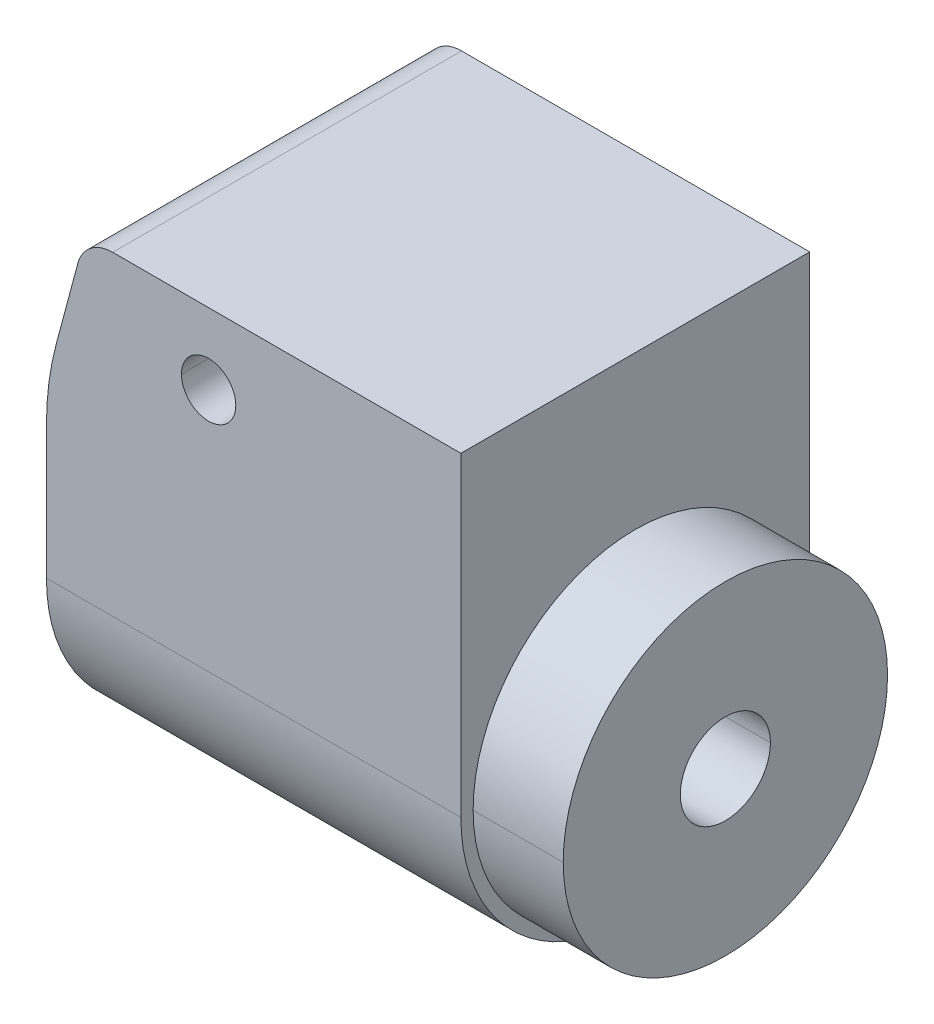
ISO-10303-21;
HEADER;
FILE_DESCRIPTION(('STEP AP214'),'2;1');
FILE_NAME('part.step','',(''),(''),'','','');
FILE_SCHEMA(('AUTOMOTIVE_DESIGN { 1 0 10303 214 1 1 1 1 }'));
ENDSEC;
DATA;
#1=APPLICATION_CONTEXT('core data for automotive mechanical design processes');
#2=APPLICATION_PROTOCOL_DEFINITION('international standard','automotive_design',2000,#1);
#3=PRODUCT_CONTEXT('',#1,'mechanical');
#4=PRODUCT('Part','Part','',(#3));
#5=PRODUCT_RELATED_PRODUCT_CATEGORY('part','',(#4));
#6=PRODUCT_DEFINITION_FORMATION('','',#4);
#7=PRODUCT_DEFINITION_CONTEXT('part definition',#1,'design');
#8=PRODUCT_DEFINITION('design','',#6,#7);
#9=PRODUCT_DEFINITION_SHAPE('','',#8);
#10=(LENGTH_UNIT() NAMED_UNIT(*) SI_UNIT(.MILLI.,.METRE.));
#11=(NAMED_UNIT(*) PLANE_ANGLE_UNIT() SI_UNIT($,.RADIAN.));
#12=(NAMED_UNIT(*) SI_UNIT($,.STERADIAN.) SOLID_ANGLE_UNIT());
#13=UNCERTAINTY_MEASURE_WITH_UNIT(LENGTH_MEASURE(1.E-05),#10,'distance_accuracy_value','');
#14=(GEOMETRIC_REPRESENTATION_CONTEXT(3) GLOBAL_UNCERTAINTY_ASSIGNED_CONTEXT((#13)) GLOBAL_UNIT_ASSIGNED_CONTEXT((#10,
#11,#12)) REPRESENTATION_CONTEXT('',''));
#15=CARTESIAN_POINT('',(0.,0.,0.));
#16=DIRECTION('',(0.,0.,1.));
#17=DIRECTION('',(1.,0.,0.));
#18=AXIS2_PLACEMENT_3D('',#15,#16,#17);
#19=CARTESIAN_POINT('',(-33.4137,72.85602656128,36.5125));
#20=DIRECTION('',(0.,0.,-1.));
#21=DIRECTION('',(-1.,0.,0.));
#22=AXIS2_PLACEMENT_3D('',#19,#20,#21);
#23=CYLINDRICAL_SURFACE('',#22,25.4);
#24=CARTESIAN_POINT('',(-33.4137,72.85602656128,51.8795));
#25=DIRECTION('',(0.,0.,1.));
#26=DIRECTION('',(0.,1.,0.));
#27=AXIS2_PLACEMENT_3D('',#24,#25,#26);
#28=CIRCLE('',#27,25.4);
#29=CARTESIAN_POINT('',(-57.9482159877424,79.430030306884,51.8795));
#30=VERTEX_POINT('',#29);
#31=CARTESIAN_POINT('',(-58.8137,72.85602656128,51.8795));
#32=VERTEX_POINT('',#31);
#33=EDGE_CURVE('E109',#30,#32,#28,.T.);
#34=ORIENTED_EDGE('',*,*,#33,.F.);
#35=DIRECTION('',(0.,0.,1.));
#36=VECTOR('',#35,1.);
#37=CARTESIAN_POINT('',(-57.9482159877424,79.430030306884,51.8795));
#38=LINE('',#37,#36);
#39=CARTESIAN_POINT('',(-57.9482159877424,79.430030306884,21.1455));
#40=VERTEX_POINT('',#39);
#41=EDGE_CURVE('E27',#40,#30,#38,.T.);
#42=ORIENTED_EDGE('',*,*,#41,.F.);
#43=CARTESIAN_POINT('',(-33.4137,72.85602656128,21.1455));
#44=DIRECTION('',(0.,0.,-1.));
#45=DIRECTION('',(0.,-1.,0.));
#46=AXIS2_PLACEMENT_3D('',#43,#44,#45);
#47=CIRCLE('',#46,25.4);
#48=CARTESIAN_POINT('',(-58.8137,72.85602656128,21.1455));
#49=VERTEX_POINT('',#48);
#50=EDGE_CURVE('E174',#49,#40,#47,.T.);
#51=ORIENTED_EDGE('',*,*,#50,.F.);
#52=DIRECTION('',(0.,0.,-1.));
#53=VECTOR('',#52,1.);
#54=CARTESIAN_POINT('',(-58.8137,72.85602656128,21.1455));
#55=LINE('',#54,#53);
#56=EDGE_CURVE('E42',#32,#49,#55,.T.);
#57=ORIENTED_EDGE('',*,*,#56,.F.);
#58=EDGE_LOOP('',(#34,#42,#51,#57));
#59=FACE_BOUND('',#58,.T.);
#60=ADVANCED_FACE('F16',(#59),#23,.T.);
#61=CARTESIAN_POINT('',(-52.9744820692915,85.725,51.8795));
#62=DIRECTION('',(0.,0.,1.));
#63=DIRECTION('',(1.,0.,0.));
#64=AXIS2_PLACEMENT_3D('',#61,#62,#63);
#65=CYLINDRICAL_SURFACE('',#64,3.175);
#66=CARTESIAN_POINT('',(-52.9744820692915,85.725,21.1455));
#67=DIRECTION('',(0.,0.,-1.));
#68=DIRECTION('',(0.,-1.,0.));
#69=AXIS2_PLACEMENT_3D('',#66,#67,#68);
#70=CIRCLE('',#69,3.175);
#71=CARTESIAN_POINT('',(-56.0412965677594,86.5467504682005,21.1455));
#72=VERTEX_POINT('',#71);
#73=CARTESIAN_POINT('',(-52.9744820692915,88.9,21.1455));
#74=VERTEX_POINT('',#73);
#75=EDGE_CURVE('E89',#72,#74,#70,.T.);
#76=ORIENTED_EDGE('',*,*,#75,.F.);
#77=DIRECTION('',(0.,0.,-1.));
#78=VECTOR('',#77,1.);
#79=CARTESIAN_POINT('',(-56.0412965677594,86.5467504682005,21.1455));
#80=LINE('',#79,#78);
#81=CARTESIAN_POINT('',(-56.0412965677594,86.5467504682005,51.8795));
#82=VERTEX_POINT('',#81);
#83=EDGE_CURVE('E10',#82,#72,#80,.T.);
#84=ORIENTED_EDGE('',*,*,#83,.F.);
#85=CARTESIAN_POINT('',(-52.9744820692915,85.725,51.8795));
#86=DIRECTION('',(0.,0.,1.));
#87=DIRECTION('',(0.,1.,0.));
#88=AXIS2_PLACEMENT_3D('',#85,#86,#87);
#89=CIRCLE('',#88,3.175);
#90=CARTESIAN_POINT('',(-52.9744820692915,88.9,51.8795));
#91=VERTEX_POINT('',#90);
#92=EDGE_CURVE('E85',#91,#82,#89,.T.);
#93=ORIENTED_EDGE('',*,*,#92,.F.);
#94=DIRECTION('',(0.,0.,1.));
#95=VECTOR('',#94,1.);
#96=CARTESIAN_POINT('',(-52.9744820692915,88.9,51.8795));
#97=LINE('',#96,#95);
#98=EDGE_CURVE('E118',#74,#91,#97,.T.);
#99=ORIENTED_EDGE('',*,*,#98,.F.);
#100=EDGE_LOOP('',(#76,#84,#93,#99));
#101=FACE_BOUND('',#100,.T.);
#102=ADVANCED_FACE('F83',(#101),#65,.T.);
#103=CARTESIAN_POINT('',(-55.4107452561247,88.9,51.8795));
#104=DIRECTION('',(0.965925826289069,-0.258819045102518,0.));
#105=DIRECTION('',(0.,0.,-1.));
#106=AXIS2_PLACEMENT_3D('',#103,#104,#105);
#107=PLANE('',#106);
#108=DIRECTION('',(0.258819045102518,0.965925826289069,0.));
#109=VECTOR('',#108,1.);
#110=CARTESIAN_POINT('',(-55.4107452561247,88.9,21.1455));
#111=LINE('',#110,#109);
#112=EDGE_CURVE('E184',#40,#72,#111,.T.);
#113=ORIENTED_EDGE('',*,*,#112,.F.);
#114=ORIENTED_EDGE('',*,*,#41,.T.);
#115=DIRECTION('',(-0.258819045102518,-0.965925826289069,0.));
#116=VECTOR('',#115,1.);
#117=CARTESIAN_POINT('',(-55.4107452561247,88.9,51.8795));
#118=LINE('',#117,#116);
#119=EDGE_CURVE('E98',#82,#30,#118,.T.);
#120=ORIENTED_EDGE('',*,*,#119,.F.);
#121=ORIENTED_EDGE('',*,*,#83,.T.);
#122=EDGE_LOOP('',(#113,#114,#120,#121));
#123=FACE_BOUND('',#122,.T.);
#124=ADVANCED_FACE('F18',(#123),#107,.F.);
#125=CARTESIAN_POINT('',(-44.5262,82.63255,21.1455));
#126=DIRECTION('',(0.,0.,1.));
#127=DIRECTION('',(1.,0.,0.));
#128=AXIS2_PLACEMENT_3D('',#125,#126,#127);
#129=CYLINDRICAL_SURFACE('',#128,2.39395);
#130=DIRECTION('',(0.,0.,1.));
#131=VECTOR('',#130,1.);
#132=CARTESIAN_POINT('',(-46.92015,82.63255,21.1455));
#133=LINE('',#132,#131);
#134=CARTESIAN_POINT('',(-46.92015,82.63255,21.1455));
#135=VERTEX_POINT('',#134);
#136=CARTESIAN_POINT('',(-46.92015,82.63255,51.8795));
#137=VERTEX_POINT('',#136);
#138=EDGE_CURVE('E169',#135,#137,#133,.T.);
#139=ORIENTED_EDGE('',*,*,#138,.F.);
#140=CARTESIAN_POINT('',(-44.5262,82.63255,21.1455));
#141=DIRECTION('',(0.,0.,1.));
#142=DIRECTION('',(1.,0.,0.));
#143=AXIS2_PLACEMENT_3D('',#140,#141,#142);
#144=CIRCLE('',#143,2.39395);
#145=CARTESIAN_POINT('',(-42.13225,82.63255,21.1455));
#146=VERTEX_POINT('',#145);
#147=EDGE_CURVE('E180',#146,#135,#144,.T.);
#148=ORIENTED_EDGE('',*,*,#147,.F.);
#149=DIRECTION('',(0.,0.,1.));
#150=VECTOR('',#149,1.);
#151=CARTESIAN_POINT('',(-42.13225,82.63255,21.1455));
#152=LINE('',#151,#150);
#153=CARTESIAN_POINT('',(-42.13225,82.63255,51.8795));
#154=VERTEX_POINT('',#153);
#155=EDGE_CURVE('E131',#146,#154,#152,.T.);
#156=ORIENTED_EDGE('',*,*,#155,.T.);
#157=CARTESIAN_POINT('',(-44.5262,82.63255,51.8795));
#158=DIRECTION('',(0.,0.,1.));
#159=DIRECTION('',(1.,0.,0.));
#160=AXIS2_PLACEMENT_3D('',#157,#158,#159);
#161=CIRCLE('',#160,2.39395);
#162=EDGE_CURVE('E104',#154,#137,#161,.T.);
#163=ORIENTED_EDGE('',*,*,#162,.T.);
#164=EDGE_LOOP('',(#139,#148,#156,#163));
#165=FACE_BOUND('',#164,.T.);
#166=ADVANCED_FACE('F417',(#165),#129,.F.);
#167=CARTESIAN_POINT('',(-58.8137,61.11875,36.5125));
#168=DIRECTION('',(1.,0.,0.));
#169=DIRECTION('',(0.,0.,-1.));
#170=AXIS2_PLACEMENT_3D('',#167,#168,#169);
#171=CYLINDRICAL_SURFACE('',#170,3.96875);
#172=DIRECTION('',(1.,0.,0.));
#173=VECTOR('',#172,1.);
#174=CARTESIAN_POINT('',(-58.8137,61.11875,40.48125));
#175=LINE('',#174,#173);
#176=CARTESIAN_POINT('',(-58.8137,61.11875,40.48125));
#177=VERTEX_POINT('',#176);
#178=CARTESIAN_POINT('',(-14.3637,61.11875,40.48125));
#179=VERTEX_POINT('',#178);
#180=EDGE_CURVE('E151',#177,#179,#175,.T.);
#181=ORIENTED_EDGE('',*,*,#180,.F.);
#182=CARTESIAN_POINT('',(-58.8137,61.11875,36.5125));
#183=DIRECTION('',(1.,0.,0.));
#184=DIRECTION('',(0.,0.,-1.));
#185=AXIS2_PLACEMENT_3D('',#182,#183,#184);
#186=CIRCLE('',#185,3.96875);
#187=CARTESIAN_POINT('',(-58.8137,61.11875,32.54375));
#188=VERTEX_POINT('',#187);
#189=EDGE_CURVE('E179',#188,#177,#186,.T.);
#190=ORIENTED_EDGE('',*,*,#189,.F.);
#191=DIRECTION('',(1.,0.,0.));
#192=VECTOR('',#191,1.);
#193=CARTESIAN_POINT('',(-58.8137,61.11875,32.54375));
#194=LINE('',#193,#192);
#195=CARTESIAN_POINT('',(-14.3637,61.11875,32.54375));
#196=VERTEX_POINT('',#195);
#197=EDGE_CURVE('E144',#188,#196,#194,.T.);
#198=ORIENTED_EDGE('',*,*,#197,.T.);
#199=CARTESIAN_POINT('',(-14.3637,61.11875,36.5125));
#200=DIRECTION('',(1.,0.,0.));
#201=DIRECTION('',(0.,0.,-1.));
#202=AXIS2_PLACEMENT_3D('',#199,#200,#201);
#203=CIRCLE('',#202,3.96875);
#204=EDGE_CURVE('E136',#196,#179,#203,.T.);
#205=ORIENTED_EDGE('',*,*,#204,.T.);
#206=EDGE_LOOP('',(#181,#190,#198,#205));
#207=FACE_BOUND('',#206,.T.);
#208=ADVANCED_FACE('F421',(#207),#171,.F.);
#209=CARTESIAN_POINT('',(-14.3637,61.11875,36.5125));
#210=DIRECTION('',(1.,0.,0.));
#211=DIRECTION('',(0.,1.,0.));
#212=AXIS2_PLACEMENT_3D('',#209,#210,#211);
#213=PLANE('',#212);
#214=ORIENTED_EDGE('',*,*,#204,.F.);
#215=CARTESIAN_POINT('',(-14.3637,61.11875,36.5125));
#216=DIRECTION('',(1.,0.,0.));
#217=DIRECTION('',(0.,0.,-1.));
#218=AXIS2_PLACEMENT_3D('',#215,#216,#217);
#219=CIRCLE('',#218,3.96875);
#220=EDGE_CURVE('E155',#179,#196,#219,.T.);
#221=ORIENTED_EDGE('',*,*,#220,.F.);
#222=EDGE_LOOP('',(#214,#221));
#223=FACE_BOUND('',#222,.T.);
#224=CARTESIAN_POINT('',(-14.3637,61.11875,36.5125));
#225=DIRECTION('',(1.,0.,0.));
#226=DIRECTION('',(0.,0.,-1.));
#227=AXIS2_PLACEMENT_3D('',#224,#225,#226);
#228=CIRCLE('',#227,14.2875);
#229=CARTESIAN_POINT('',(-14.3637,61.11875,50.8));
#230=VERTEX_POINT('',#229);
#231=CARTESIAN_POINT('',(-14.3637,61.11875,22.225));
#232=VERTEX_POINT('',#231);
#233=EDGE_CURVE('E139',#230,#232,#228,.T.);
#234=ORIENTED_EDGE('',*,*,#233,.T.);
#235=CARTESIAN_POINT('',(-14.3637,61.11875,36.5125));
#236=DIRECTION('',(1.,0.,0.));
#237=DIRECTION('',(0.,0.,-1.));
#238=AXIS2_PLACEMENT_3D('',#235,#236,#237);
#239=CIRCLE('',#238,14.2875);
#240=EDGE_CURVE('E140',#232,#230,#239,.T.);
#241=ORIENTED_EDGE('',*,*,#240,.T.);
#242=EDGE_LOOP('',(#234,#241));
#243=FACE_BOUND('',#242,.T.);
#244=ADVANCED_FACE('F388',(#223,#243),#213,.T.);
#245=CARTESIAN_POINT('',(-14.3637,61.11875,36.5125));
#246=DIRECTION('',(-1.,0.,0.));
#247=DIRECTION('',(0.,0.,1.));
#248=AXIS2_PLACEMENT_3D('',#245,#246,#247);
#249=CYLINDRICAL_SURFACE('',#248,14.2875);
#250=DIRECTION('',(-1.,0.,0.));
#251=VECTOR('',#250,1.);
#252=CARTESIAN_POINT('',(-14.3637,61.11875,22.225));
#253=LINE('',#252,#251);
#254=CARTESIAN_POINT('',(-22.3012,61.11875,22.225));
#255=VERTEX_POINT('',#254);
#256=EDGE_CURVE('E143',#232,#255,#253,.T.);
#257=ORIENTED_EDGE('',*,*,#256,.F.);
#258=ORIENTED_EDGE('',*,*,#233,.F.);
#259=DIRECTION('',(-1.,0.,0.));
#260=VECTOR('',#259,1.);
#261=CARTESIAN_POINT('',(-14.3637,61.11875,50.8));
#262=LINE('',#261,#260);
#263=CARTESIAN_POINT('',(-22.3012,61.11875,50.8));
#264=VERTEX_POINT('',#263);
#265=EDGE_CURVE('E149',#230,#264,#262,.T.);
#266=ORIENTED_EDGE('',*,*,#265,.T.);
#267=CARTESIAN_POINT('',(-22.3012,61.11875,36.5125));
#268=DIRECTION('',(1.,0.,0.));
#269=DIRECTION('',(0.,0.,-1.));
#270=AXIS2_PLACEMENT_3D('',#267,#268,#269);
#271=CIRCLE('',#270,14.2875);
#272=EDGE_CURVE('E124',#264,#255,#271,.T.);
#273=ORIENTED_EDGE('',*,*,#272,.T.);
#274=EDGE_LOOP('',(#257,#258,#266,#273));
#275=FACE_BOUND('',#274,.T.);
#276=ADVANCED_FACE('F384',(#275),#249,.T.);
#277=CARTESIAN_POINT('',(-58.8137,61.11875,36.5125));
#278=DIRECTION('',(1.,0.,0.));
#279=DIRECTION('',(0.,1.,0.));
#280=AXIS2_PLACEMENT_3D('',#277,#278,#279);
#281=PLANE('',#280);
#282=ORIENTED_EDGE('',*,*,#189,.T.);
#283=CARTESIAN_POINT('',(-58.8137,61.11875,36.5125));
#284=DIRECTION('',(1.,0.,0.));
#285=DIRECTION('',(0.,0.,-1.));
#286=AXIS2_PLACEMENT_3D('',#283,#284,#285);
#287=CIRCLE('',#286,3.96875);
#288=EDGE_CURVE('E122',#177,#188,#287,.T.);
#289=ORIENTED_EDGE('',*,*,#288,.T.);
#290=EDGE_LOOP('',(#282,#289));
#291=FACE_BOUND('',#290,.T.);
#292=DIRECTION('',(0.,-1.,0.));
#293=VECTOR('',#292,1.);
#294=CARTESIAN_POINT('',(-58.8137,61.11875,51.8795));
#295=LINE('',#294,#293);
#296=CARTESIAN_POINT('',(-58.8137,61.11875,51.8795));
#297=VERTEX_POINT('',#296);
#298=EDGE_CURVE('E105',#32,#297,#295,.T.);
#299=ORIENTED_EDGE('',*,*,#298,.F.);
#300=ORIENTED_EDGE('',*,*,#56,.T.);
#301=DIRECTION('',(0.,1.,0.));
#302=VECTOR('',#301,1.);
#303=CARTESIAN_POINT('',(-58.8137,88.9,21.1455));
#304=LINE('',#303,#302);
#305=CARTESIAN_POINT('',(-58.8137,61.11875,21.1455));
#306=VERTEX_POINT('',#305);
#307=EDGE_CURVE('E170',#306,#49,#304,.T.);
#308=ORIENTED_EDGE('',*,*,#307,.F.);
#309=CARTESIAN_POINT('',(-58.8137,61.11875,36.5125));
#310=DIRECTION('',(1.,0.,0.));
#311=DIRECTION('',(0.,0.,-1.));
#312=AXIS2_PLACEMENT_3D('',#309,#310,#311);
#313=CIRCLE('',#312,15.367);
#314=EDGE_CURVE('E126',#297,#306,#313,.T.);
#315=ORIENTED_EDGE('',*,*,#314,.F.);
#316=EDGE_LOOP('',(#299,#300,#308,#315));
#317=FACE_BOUND('',#316,.T.);
#318=ADVANCED_FACE('F351',(#291,#317),#281,.F.);
#319=CARTESIAN_POINT('',(-22.3012,61.11875,51.8795));
#320=DIRECTION('',(0.,0.,-1.));
#321=DIRECTION('',(0.,-1.,0.));
#322=AXIS2_PLACEMENT_3D('',#319,#320,#321);
#323=PLANE('',#322);
#324=ORIENTED_EDGE('',*,*,#162,.F.);
#325=CARTESIAN_POINT('',(-44.5262,82.63255,51.8795));
#326=DIRECTION('',(0.,0.,1.));
#327=DIRECTION('',(1.,0.,0.));
#328=AXIS2_PLACEMENT_3D('',#325,#326,#327);
#329=CIRCLE('',#328,2.39395);
#330=EDGE_CURVE('E135',#137,#154,#329,.T.);
#331=ORIENTED_EDGE('',*,*,#330,.F.);
#332=EDGE_LOOP('',(#324,#331));
#333=FACE_BOUND('',#332,.T.);
#334=ORIENTED_EDGE('',*,*,#119,.T.);
#335=ORIENTED_EDGE('',*,*,#33,.T.);
#336=ORIENTED_EDGE('',*,*,#298,.T.);
#337=DIRECTION('',(-1.,0.,0.));
#338=VECTOR('',#337,1.);
#339=CARTESIAN_POINT('',(-22.3012,61.11875,51.8795));
#340=LINE('',#339,#338);
#341=CARTESIAN_POINT('',(-22.3012,61.11875,51.8795));
#342=VERTEX_POINT('',#341);
#343=EDGE_CURVE('E175',#342,#297,#340,.T.);
#344=ORIENTED_EDGE('',*,*,#343,.F.);
#345=DIRECTION('',(0.,-1.,0.));
#346=VECTOR('',#345,1.);
#347=CARTESIAN_POINT('',(-22.3012,61.11875,51.8795));
#348=LINE('',#347,#346);
#349=CARTESIAN_POINT('',(-22.3012,88.9,51.8795));
#350=VERTEX_POINT('',#349);
#351=EDGE_CURVE('E127',#350,#342,#348,.T.);
#352=ORIENTED_EDGE('',*,*,#351,.F.);
#353=DIRECTION('',(-1.,0.,0.));
#354=VECTOR('',#353,1.);
#355=CARTESIAN_POINT('',(-22.3012,88.9,51.8795));
#356=LINE('',#355,#354);
#357=EDGE_CURVE('E101',#350,#91,#356,.T.);
#358=ORIENTED_EDGE('',*,*,#357,.T.);
#359=ORIENTED_EDGE('',*,*,#92,.T.);
#360=EDGE_LOOP('',(#334,#335,#336,#344,#352,#358,#359));
#361=FACE_BOUND('',#360,.T.);
#362=ADVANCED_FACE('F96',(#333,#361),#323,.F.);
#363=CARTESIAN_POINT('',(-22.3012,88.9,51.8795));
#364=DIRECTION('',(0.,-1.,0.));
#365=DIRECTION('',(0.,0.,-1.));
#366=AXIS2_PLACEMENT_3D('',#363,#364,#365);
#367=PLANE('',#366);
#368=DIRECTION('',(-1.,0.,0.));
#369=VECTOR('',#368,1.);
#370=CARTESIAN_POINT('',(-22.3012,88.9,21.1455));
#371=LINE('',#370,#369);
#372=CARTESIAN_POINT('',(-22.3012,88.9,21.1455));
#373=VERTEX_POINT('',#372);
#374=EDGE_CURVE('E20',#373,#74,#371,.T.);
#375=ORIENTED_EDGE('',*,*,#374,.T.);
#376=ORIENTED_EDGE('',*,*,#98,.T.);
#377=ORIENTED_EDGE('',*,*,#357,.F.);
#378=DIRECTION('',(0.,0.,1.));
#379=VECTOR('',#378,1.);
#380=CARTESIAN_POINT('',(-22.3012,88.9,51.8795));
#381=LINE('',#380,#379);
#382=EDGE_CURVE('E163',#373,#350,#381,.T.);
#383=ORIENTED_EDGE('',*,*,#382,.F.);
#384=EDGE_LOOP('',(#375,#376,#377,#383));
#385=FACE_BOUND('',#384,.T.);
#386=ADVANCED_FACE('F350',(#385),#367,.F.);
#387=CARTESIAN_POINT('',(-22.3012,88.9,21.1455));
#388=DIRECTION('',(0.,0.,1.));
#389=DIRECTION('',(0.,-1.,0.));
#390=AXIS2_PLACEMENT_3D('',#387,#388,#389);
#391=PLANE('',#390);
#392=ORIENTED_EDGE('',*,*,#147,.T.);
#393=CARTESIAN_POINT('',(-44.5262,82.63255,21.1455));
#394=DIRECTION('',(0.,0.,1.));
#395=DIRECTION('',(1.,0.,0.));
#396=AXIS2_PLACEMENT_3D('',#393,#394,#395);
#397=CIRCLE('',#396,2.39395);
#398=EDGE_CURVE('E165',#135,#146,#397,.T.);
#399=ORIENTED_EDGE('',*,*,#398,.T.);
#400=EDGE_LOOP('',(#392,#399));
#401=FACE_BOUND('',#400,.T.);
#402=ORIENTED_EDGE('',*,*,#307,.T.);
#403=ORIENTED_EDGE('',*,*,#50,.T.);
#404=ORIENTED_EDGE('',*,*,#112,.T.);
#405=ORIENTED_EDGE('',*,*,#75,.T.);
#406=ORIENTED_EDGE('',*,*,#374,.F.);
#407=DIRECTION('',(0.,1.,0.));
#408=VECTOR('',#407,1.);
#409=CARTESIAN_POINT('',(-22.3012,88.9,21.1455));
#410=LINE('',#409,#408);
#411=CARTESIAN_POINT('',(-22.3012,61.11875,21.1455));
#412=VERTEX_POINT('',#411);
#413=EDGE_CURVE('E159',#412,#373,#410,.T.);
#414=ORIENTED_EDGE('',*,*,#413,.F.);
#415=DIRECTION('',(-1.,0.,0.));
#416=VECTOR('',#415,1.);
#417=CARTESIAN_POINT('',(-22.3012,61.11875,21.1455));
#418=LINE('',#417,#416);
#419=EDGE_CURVE('E201',#412,#306,#418,.T.);
#420=ORIENTED_EDGE('',*,*,#419,.T.);
#421=EDGE_LOOP('',(#402,#403,#404,#405,#406,#414,#420));
#422=FACE_BOUND('',#421,.T.);
#423=ADVANCED_FACE('F360',(#401,#422),#391,.F.);
#424=CARTESIAN_POINT('',(-22.3012,61.11875,36.5125));
#425=DIRECTION('',(-1.,0.,0.));
#426=DIRECTION('',(0.,0.,1.));
#427=AXIS2_PLACEMENT_3D('',#424,#425,#426);
#428=CYLINDRICAL_SURFACE('',#427,15.367);
#429=ORIENTED_EDGE('',*,*,#314,.T.);
#430=ORIENTED_EDGE('',*,*,#419,.F.);
#431=CARTESIAN_POINT('',(-22.3012,61.11875,36.5125));
#432=DIRECTION('',(1.,0.,0.));
#433=DIRECTION('',(0.,0.,-1.));
#434=AXIS2_PLACEMENT_3D('',#431,#432,#433);
#435=CIRCLE('',#434,15.367);
#436=EDGE_CURVE('E164',#342,#412,#435,.T.);
#437=ORIENTED_EDGE('',*,*,#436,.F.);
#438=ORIENTED_EDGE('',*,*,#343,.T.);
#439=EDGE_LOOP('',(#429,#430,#437,#438));
#440=FACE_BOUND('',#439,.T.);
#441=ADVANCED_FACE('F341',(#440),#428,.T.);
#442=CARTESIAN_POINT('',(-22.3012,61.11875,36.5125));
#443=DIRECTION('',(1.,0.,0.));
#444=DIRECTION('',(0.,1.,0.));
#445=AXIS2_PLACEMENT_3D('',#442,#443,#444);
#446=PLANE('',#445);
#447=ORIENTED_EDGE('',*,*,#272,.F.);
#448=CARTESIAN_POINT('',(-22.3012,61.11875,36.5125));
#449=DIRECTION('',(1.,0.,0.));
#450=DIRECTION('',(0.,0.,-1.));
#451=AXIS2_PLACEMENT_3D('',#448,#449,#450);
#452=CIRCLE('',#451,14.2875);
#453=EDGE_CURVE('E146',#255,#264,#452,.T.);
#454=ORIENTED_EDGE('',*,*,#453,.F.);
#455=EDGE_LOOP('',(#447,#454));
#456=FACE_BOUND('',#455,.T.);
#457=ORIENTED_EDGE('',*,*,#436,.T.);
#458=ORIENTED_EDGE('',*,*,#413,.T.);
#459=ORIENTED_EDGE('',*,*,#382,.T.);
#460=ORIENTED_EDGE('',*,*,#351,.T.);
#461=EDGE_LOOP('',(#457,#458,#459,#460));
#462=FACE_BOUND('',#461,.T.);
#463=ADVANCED_FACE('F336',(#456,#462),#446,.T.);
#464=CARTESIAN_POINT('',(-14.3637,61.11875,36.5125));
#465=DIRECTION('',(-1.,0.,0.));
#466=DIRECTION('',(0.,0.,1.));
#467=AXIS2_PLACEMENT_3D('',#464,#465,#466);
#468=CYLINDRICAL_SURFACE('',#467,14.2875);
#469=ORIENTED_EDGE('',*,*,#240,.F.);
#470=ORIENTED_EDGE('',*,*,#256,.T.);
#471=ORIENTED_EDGE('',*,*,#453,.T.);
#472=ORIENTED_EDGE('',*,*,#265,.F.);
#473=EDGE_LOOP('',(#469,#470,#471,#472));
#474=FACE_BOUND('',#473,.T.);
#475=ADVANCED_FACE('F340',(#474),#468,.T.);
#476=CARTESIAN_POINT('',(-58.8137,61.11875,36.5125));
#477=DIRECTION('',(1.,0.,0.));
#478=DIRECTION('',(0.,0.,-1.));
#479=AXIS2_PLACEMENT_3D('',#476,#477,#478);
#480=CYLINDRICAL_SURFACE('',#479,3.96875);
#481=ORIENTED_EDGE('',*,*,#288,.F.);
#482=ORIENTED_EDGE('',*,*,#180,.T.);
#483=ORIENTED_EDGE('',*,*,#220,.T.);
#484=ORIENTED_EDGE('',*,*,#197,.F.);
#485=EDGE_LOOP('',(#481,#482,#483,#484));
#486=FACE_BOUND('',#485,.T.);
#487=ADVANCED_FACE('F370',(#486),#480,.F.);
#488=CARTESIAN_POINT('',(-44.5262,82.63255,21.1455));
#489=DIRECTION('',(0.,0.,1.));
#490=DIRECTION('',(1.,0.,0.));
#491=AXIS2_PLACEMENT_3D('',#488,#489,#490);
#492=CYLINDRICAL_SURFACE('',#491,2.39395);
#493=ORIENTED_EDGE('',*,*,#398,.F.);
#494=ORIENTED_EDGE('',*,*,#138,.T.);
#495=ORIENTED_EDGE('',*,*,#330,.T.);
#496=ORIENTED_EDGE('',*,*,#155,.F.);
#497=EDGE_LOOP('',(#493,#494,#495,#496));
#498=FACE_BOUND('',#497,.T.);
#499=ADVANCED_FACE('F366',(#498),#492,.F.);
#500=CLOSED_SHELL('',(#60,#102,#124,#166,#208,#244,#276,#318,#362,#386,#423,#441,#463,#475,#487,#499));
#501=MANIFOLD_SOLID_BREP('B1',#500);
#502=ADVANCED_BREP_SHAPE_REPRESENTATION('',(#18,#501),#14);
#503=SHAPE_DEFINITION_REPRESENTATION(#9,#502);
ENDSEC;
END-ISO-10303-21;
